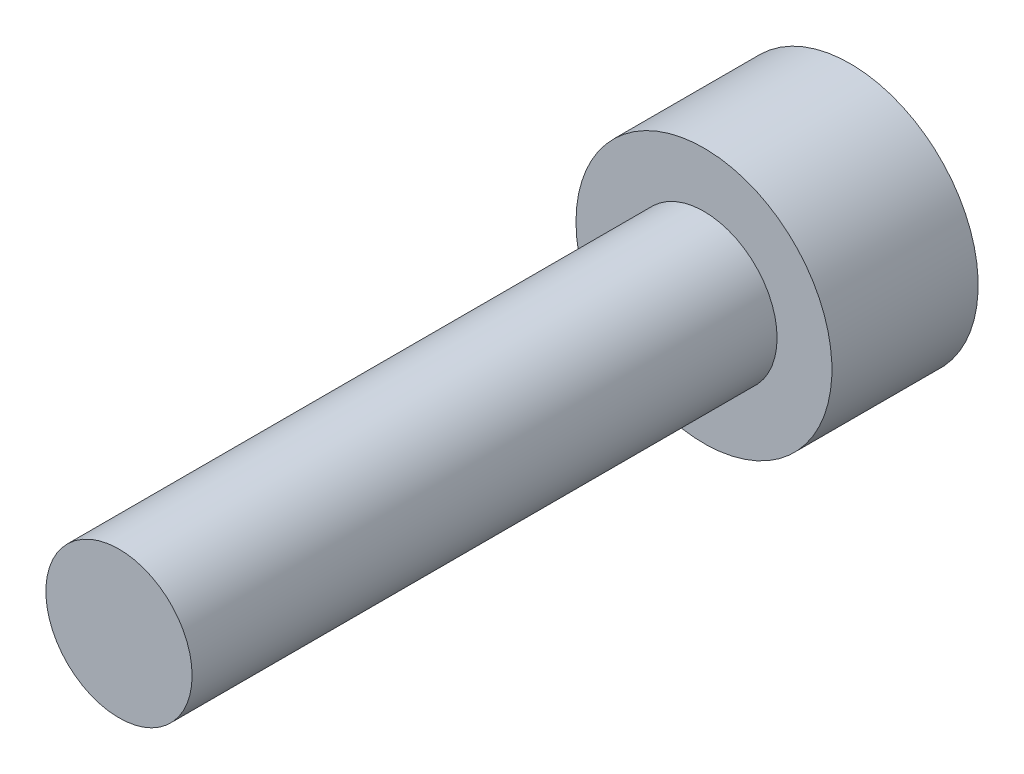
ISO-10303-21;
HEADER;
FILE_DESCRIPTION(('STEP AP214'),'2;1');
FILE_NAME('part.step','',(''),(''),'','','');
FILE_SCHEMA(('AUTOMOTIVE_DESIGN { 1 0 10303 214 1 1 1 1 }'));
ENDSEC;
DATA;
#1=APPLICATION_CONTEXT('core data for automotive mechanical design processes');
#2=APPLICATION_PROTOCOL_DEFINITION('international standard','automotive_design',2000,#1);
#3=PRODUCT_CONTEXT('',#1,'mechanical');
#4=PRODUCT('Part','Part','',(#3));
#5=PRODUCT_RELATED_PRODUCT_CATEGORY('part','',(#4));
#6=PRODUCT_DEFINITION_FORMATION('','',#4);
#7=PRODUCT_DEFINITION_CONTEXT('part definition',#1,'design');
#8=PRODUCT_DEFINITION('design','',#6,#7);
#9=PRODUCT_DEFINITION_SHAPE('','',#8);
#10=(LENGTH_UNIT() NAMED_UNIT(*) SI_UNIT(.MILLI.,.METRE.));
#11=(NAMED_UNIT(*) PLANE_ANGLE_UNIT() SI_UNIT($,.RADIAN.));
#12=(NAMED_UNIT(*) SI_UNIT($,.STERADIAN.) SOLID_ANGLE_UNIT());
#13=UNCERTAINTY_MEASURE_WITH_UNIT(LENGTH_MEASURE(1.E-05),#10,'distance_accuracy_value','');
#14=(GEOMETRIC_REPRESENTATION_CONTEXT(3) GLOBAL_UNCERTAINTY_ASSIGNED_CONTEXT((#13)) GLOBAL_UNIT_ASSIGNED_CONTEXT((#10,
#11,#12)) REPRESENTATION_CONTEXT('',''));
#15=CARTESIAN_POINT('',(0.,0.,0.));
#16=DIRECTION('',(0.,0.,1.));
#17=DIRECTION('',(1.,0.,0.));
#18=AXIS2_PLACEMENT_3D('',#15,#16,#17);
#19=CARTESIAN_POINT('',(3.5,0.,4.));
#20=DIRECTION('',(0.,0.,1.));
#21=DIRECTION('',(1.,0.,0.));
#22=AXIS2_PLACEMENT_3D('',#19,#20,#21);
#23=PLANE('',#22);
#24=CARTESIAN_POINT('',(0.,0.,4.));
#25=DIRECTION('',(0.,0.,-1.));
#26=DIRECTION('',(-1.,0.,0.));
#27=AXIS2_PLACEMENT_3D('',#24,#25,#26);
#28=CIRCLE('',#27,3.5);
#29=CARTESIAN_POINT('',(-3.5,0.,4.));
#30=VERTEX_POINT('',#29);
#31=EDGE_CURVE('E11',#30,#30,#28,.T.);
#32=ORIENTED_EDGE('',*,*,#31,.F.);
#33=EDGE_LOOP('',(#32));
#34=FACE_BOUND('',#33,.T.);
#35=CARTESIAN_POINT('',(0.,0.,4.));
#36=DIRECTION('',(0.,0.,1.));
#37=DIRECTION('',(1.,0.,0.));
#38=AXIS2_PLACEMENT_3D('',#35,#36,#37);
#39=CIRCLE('',#38,2.);
#40=CARTESIAN_POINT('',(2.,0.,4.));
#41=VERTEX_POINT('',#40);
#42=EDGE_CURVE('E132',#41,#41,#39,.T.);
#43=ORIENTED_EDGE('',*,*,#42,.F.);
#44=EDGE_LOOP('',(#43));
#45=FACE_BOUND('',#44,.T.);
#46=ADVANCED_FACE('F30',(#34,#45),#23,.T.);
#47=CARTESIAN_POINT('',(0.,0.,4.));
#48=DIRECTION('',(0.,0.,-1.));
#49=DIRECTION('',(-1.,0.,0.));
#50=AXIS2_PLACEMENT_3D('',#47,#48,#49);
#51=CYLINDRICAL_SURFACE('',#50,3.5);
#52=ORIENTED_EDGE('',*,*,#31,.T.);
#53=EDGE_LOOP('',(#52));
#54=FACE_BOUND('',#53,.T.);
#55=CARTESIAN_POINT('',(0.,0.,0.));
#56=DIRECTION('',(0.,0.,-1.));
#57=DIRECTION('',(-1.,0.,0.));
#58=AXIS2_PLACEMENT_3D('',#55,#56,#57);
#59=CIRCLE('',#58,3.5);
#60=CARTESIAN_POINT('',(-3.5,0.,0.));
#61=VERTEX_POINT('',#60);
#62=EDGE_CURVE('E38',#61,#61,#59,.T.);
#63=ORIENTED_EDGE('',*,*,#62,.F.);
#64=EDGE_LOOP('',(#63));
#65=FACE_BOUND('',#64,.T.);
#66=ADVANCED_FACE('F32',(#54,#65),#51,.T.);
#67=CARTESIAN_POINT('',(0.,0.,0.));
#68=DIRECTION('',(0.,0.,-1.));
#69=DIRECTION('',(-1.,0.,0.));
#70=AXIS2_PLACEMENT_3D('',#67,#68,#69);
#71=PLANE('',#70);
#72=DIRECTION('',(0.5,-0.866025403784439,0.));
#73=VECTOR('',#72,1.);
#74=CARTESIAN_POINT('',(0.850000000000006,1.47224318643355,0.));
#75=LINE('',#74,#73);
#76=CARTESIAN_POINT('',(0.850000000000006,1.47224318643355,0.));
#77=VERTEX_POINT('',#76);
#78=CARTESIAN_POINT('',(1.70000000000001,0.,0.));
#79=VERTEX_POINT('',#78);
#80=EDGE_CURVE('E45',#77,#79,#75,.T.);
#81=ORIENTED_EDGE('',*,*,#80,.F.);
#82=DIRECTION('',(1.,0.,0.));
#83=VECTOR('',#82,1.);
#84=CARTESIAN_POINT('',(-0.849999999999998,1.47224318643355,0.));
#85=LINE('',#84,#83);
#86=CARTESIAN_POINT('',(-0.849999999999998,1.47224318643355,0.));
#87=VERTEX_POINT('',#86);
#88=EDGE_CURVE('E128',#87,#77,#85,.T.);
#89=ORIENTED_EDGE('',*,*,#88,.F.);
#90=DIRECTION('',(0.500000000000001,0.866025403784438,0.));
#91=VECTOR('',#90,1.);
#92=CARTESIAN_POINT('',(-1.7,0.,0.));
#93=LINE('',#92,#91);
#94=CARTESIAN_POINT('',(-1.7,0.,0.));
#95=VERTEX_POINT('',#94);
#96=EDGE_CURVE('E126',#95,#87,#93,.T.);
#97=ORIENTED_EDGE('',*,*,#96,.F.);
#98=DIRECTION('',(-0.499999999999999,0.866025403784439,0.));
#99=VECTOR('',#98,1.);
#100=CARTESIAN_POINT('',(-0.849999999999999,-1.47224318643355,0.));
#101=LINE('',#100,#99);
#102=CARTESIAN_POINT('',(-0.849999999999999,-1.47224318643355,0.));
#103=VERTEX_POINT('',#102);
#104=EDGE_CURVE('E93',#103,#95,#101,.T.);
#105=ORIENTED_EDGE('',*,*,#104,.F.);
#106=DIRECTION('',(-1.,0.,0.));
#107=VECTOR('',#106,1.);
#108=CARTESIAN_POINT('',(0.850000000000003,-1.47224318643355,0.));
#109=LINE('',#108,#107);
#110=CARTESIAN_POINT('',(0.850000000000003,-1.47224318643355,0.));
#111=VERTEX_POINT('',#110);
#112=EDGE_CURVE('E122',#111,#103,#109,.T.);
#113=ORIENTED_EDGE('',*,*,#112,.F.);
#114=DIRECTION('',(-0.500000000000002,-0.866025403784438,0.));
#115=VECTOR('',#114,1.);
#116=CARTESIAN_POINT('',(1.70000000000001,0.,0.));
#117=LINE('',#116,#115);
#118=EDGE_CURVE('E119',#79,#111,#117,.T.);
#119=ORIENTED_EDGE('',*,*,#118,.F.);
#120=EDGE_LOOP('',(#81,#89,#97,#105,#113,#119));
#121=FACE_BOUND('',#120,.T.);
#122=ORIENTED_EDGE('',*,*,#62,.T.);
#123=EDGE_LOOP('',(#122));
#124=FACE_BOUND('',#123,.T.);
#125=ADVANCED_FACE('F145',(#121,#124),#71,.T.);
#126=CARTESIAN_POINT('',(0.,0.,20.));
#127=DIRECTION('',(0.,0.,-1.));
#128=DIRECTION('',(-1.,0.,0.));
#129=AXIS2_PLACEMENT_3D('',#126,#127,#128);
#130=CYLINDRICAL_SURFACE('',#129,2.);
#131=CARTESIAN_POINT('',(0.,0.,20.));
#132=DIRECTION('',(0.,0.,1.));
#133=DIRECTION('',(1.,0.,0.));
#134=AXIS2_PLACEMENT_3D('',#131,#132,#133);
#135=CIRCLE('',#134,2.);
#136=CARTESIAN_POINT('',(2.,0.,20.));
#137=VERTEX_POINT('',#136);
#138=EDGE_CURVE('E138',#137,#137,#135,.T.);
#139=ORIENTED_EDGE('',*,*,#138,.F.);
#140=EDGE_LOOP('',(#139));
#141=FACE_BOUND('',#140,.T.);
#142=ORIENTED_EDGE('',*,*,#42,.T.);
#143=EDGE_LOOP('',(#142));
#144=FACE_BOUND('',#143,.T.);
#145=ADVANCED_FACE('F153',(#141,#144),#130,.T.);
#146=CARTESIAN_POINT('',(0.,0.,20.));
#147=DIRECTION('',(0.,0.,1.));
#148=DIRECTION('',(1.,0.,0.));
#149=AXIS2_PLACEMENT_3D('',#146,#147,#148);
#150=PLANE('',#149);
#151=ORIENTED_EDGE('',*,*,#138,.T.);
#152=EDGE_LOOP('',(#151));
#153=FACE_BOUND('',#152,.T.);
#154=ADVANCED_FACE('F162',(#153),#150,.T.);
#155=CARTESIAN_POINT('',(0.850000000000006,1.47224318643355,2.4));
#156=DIRECTION('',(0.866025403784439,0.5,0.));
#157=DIRECTION('',(-0.5,0.866025403784439,0.));
#158=AXIS2_PLACEMENT_3D('',#155,#156,#157);
#159=PLANE('',#158);
#160=ORIENTED_EDGE('',*,*,#80,.T.);
#161=DIRECTION('',(0.,0.,-1.));
#162=VECTOR('',#161,1.);
#163=CARTESIAN_POINT('',(1.70000000000001,0.,2.4));
#164=LINE('',#163,#162);
#165=CARTESIAN_POINT('',(1.70000000000001,0.,2.4));
#166=VERTEX_POINT('',#165);
#167=EDGE_CURVE('E75',#166,#79,#164,.T.);
#168=ORIENTED_EDGE('',*,*,#167,.F.);
#169=DIRECTION('',(0.5,-0.866025403784439,0.));
#170=VECTOR('',#169,1.);
#171=CARTESIAN_POINT('',(0.850000000000006,1.47224318643355,2.4));
#172=LINE('',#171,#170);
#173=CARTESIAN_POINT('',(0.850000000000006,1.47224318643355,2.4));
#174=VERTEX_POINT('',#173);
#175=EDGE_CURVE('E130',#174,#166,#172,.T.);
#176=ORIENTED_EDGE('',*,*,#175,.F.);
#177=DIRECTION('',(0.,0.,-1.));
#178=VECTOR('',#177,1.);
#179=CARTESIAN_POINT('',(0.850000000000006,1.47224318643355,2.4));
#180=LINE('',#179,#178);
#181=EDGE_CURVE('E53',#174,#77,#180,.T.);
#182=ORIENTED_EDGE('',*,*,#181,.T.);
#183=EDGE_LOOP('',(#160,#168,#176,#182));
#184=FACE_BOUND('',#183,.T.);
#185=ADVANCED_FACE('F168',(#184),#159,.F.);
#186=CARTESIAN_POINT('',(-0.849999999999998,1.47224318643355,2.4));
#187=DIRECTION('',(0.,1.,0.));
#188=DIRECTION('',(-1.,0.,0.));
#189=AXIS2_PLACEMENT_3D('',#186,#187,#188);
#190=PLANE('',#189);
#191=ORIENTED_EDGE('',*,*,#88,.T.);
#192=ORIENTED_EDGE('',*,*,#181,.F.);
#193=DIRECTION('',(1.,0.,0.));
#194=VECTOR('',#193,1.);
#195=CARTESIAN_POINT('',(-0.849999999999998,1.47224318643355,2.4));
#196=LINE('',#195,#194);
#197=CARTESIAN_POINT('',(-0.849999999999998,1.47224318643355,2.4));
#198=VERTEX_POINT('',#197);
#199=EDGE_CURVE('E105',#198,#174,#196,.T.);
#200=ORIENTED_EDGE('',*,*,#199,.F.);
#201=DIRECTION('',(0.,0.,-1.));
#202=VECTOR('',#201,1.);
#203=CARTESIAN_POINT('',(-0.849999999999998,1.47224318643355,2.4));
#204=LINE('',#203,#202);
#205=EDGE_CURVE('E97',#198,#87,#204,.T.);
#206=ORIENTED_EDGE('',*,*,#205,.T.);
#207=EDGE_LOOP('',(#191,#192,#200,#206));
#208=FACE_BOUND('',#207,.T.);
#209=ADVANCED_FACE('F175',(#208),#190,.F.);
#210=CARTESIAN_POINT('',(-1.7,0.,2.4));
#211=DIRECTION('',(-0.866025403784438,0.500000000000001,0.));
#212=DIRECTION('',(-0.500000000000001,-0.866025403784438,0.));
#213=AXIS2_PLACEMENT_3D('',#210,#211,#212);
#214=PLANE('',#213);
#215=ORIENTED_EDGE('',*,*,#96,.T.);
#216=ORIENTED_EDGE('',*,*,#205,.F.);
#217=DIRECTION('',(0.500000000000001,0.866025403784438,0.));
#218=VECTOR('',#217,1.);
#219=CARTESIAN_POINT('',(-1.7,0.,2.4));
#220=LINE('',#219,#218);
#221=CARTESIAN_POINT('',(-1.7,0.,2.4));
#222=VERTEX_POINT('',#221);
#223=EDGE_CURVE('E101',#222,#198,#220,.T.);
#224=ORIENTED_EDGE('',*,*,#223,.F.);
#225=DIRECTION('',(0.,0.,-1.));
#226=VECTOR('',#225,1.);
#227=CARTESIAN_POINT('',(-1.7,0.,2.4));
#228=LINE('',#227,#226);
#229=EDGE_CURVE('E86',#222,#95,#228,.T.);
#230=ORIENTED_EDGE('',*,*,#229,.T.);
#231=EDGE_LOOP('',(#215,#216,#224,#230));
#232=FACE_BOUND('',#231,.T.);
#233=ADVANCED_FACE('F102',(#232),#214,.F.);
#234=CARTESIAN_POINT('',(-0.849999999999999,-1.47224318643355,2.4));
#235=DIRECTION('',(-0.866025403784439,-0.499999999999999,0.));
#236=DIRECTION('',(0.499999999999999,-0.866025403784439,0.));
#237=AXIS2_PLACEMENT_3D('',#234,#235,#236);
#238=PLANE('',#237);
#239=ORIENTED_EDGE('',*,*,#104,.T.);
#240=ORIENTED_EDGE('',*,*,#229,.F.);
#241=DIRECTION('',(-0.499999999999999,0.866025403784439,0.));
#242=VECTOR('',#241,1.);
#243=CARTESIAN_POINT('',(-0.849999999999999,-1.47224318643355,2.4));
#244=LINE('',#243,#242);
#245=CARTESIAN_POINT('',(-0.849999999999999,-1.47224318643355,2.4));
#246=VERTEX_POINT('',#245);
#247=EDGE_CURVE('E90',#246,#222,#244,.T.);
#248=ORIENTED_EDGE('',*,*,#247,.F.);
#249=DIRECTION('',(0.,0.,-1.));
#250=VECTOR('',#249,1.);
#251=CARTESIAN_POINT('',(-0.849999999999999,-1.47224318643355,2.4));
#252=LINE('',#251,#250);
#253=EDGE_CURVE('E98',#246,#103,#252,.T.);
#254=ORIENTED_EDGE('',*,*,#253,.T.);
#255=EDGE_LOOP('',(#239,#240,#248,#254));
#256=FACE_BOUND('',#255,.T.);
#257=ADVANCED_FACE('F88',(#256),#238,.F.);
#258=CARTESIAN_POINT('',(0.850000000000003,-1.47224318643355,2.4));
#259=DIRECTION('',(0.,-1.,0.));
#260=DIRECTION('',(1.,0.,0.));
#261=AXIS2_PLACEMENT_3D('',#258,#259,#260);
#262=PLANE('',#261);
#263=ORIENTED_EDGE('',*,*,#112,.T.);
#264=ORIENTED_EDGE('',*,*,#253,.F.);
#265=DIRECTION('',(-1.,0.,0.));
#266=VECTOR('',#265,1.);
#267=CARTESIAN_POINT('',(0.850000000000003,-1.47224318643355,2.4));
#268=LINE('',#267,#266);
#269=CARTESIAN_POINT('',(0.850000000000003,-1.47224318643355,2.4));
#270=VERTEX_POINT('',#269);
#271=EDGE_CURVE('E111',#270,#246,#268,.T.);
#272=ORIENTED_EDGE('',*,*,#271,.F.);
#273=DIRECTION('',(0.,0.,-1.));
#274=VECTOR('',#273,1.);
#275=CARTESIAN_POINT('',(0.850000000000003,-1.47224318643355,2.4));
#276=LINE('',#275,#274);
#277=EDGE_CURVE('E135',#270,#111,#276,.T.);
#278=ORIENTED_EDGE('',*,*,#277,.T.);
#279=EDGE_LOOP('',(#263,#264,#272,#278));
#280=FACE_BOUND('',#279,.T.);
#281=ADVANCED_FACE('F179',(#280),#262,.F.);
#282=CARTESIAN_POINT('',(1.70000000000001,0.,2.4));
#283=DIRECTION('',(0.866025403784438,-0.500000000000002,0.));
#284=DIRECTION('',(0.500000000000002,0.866025403784438,0.));
#285=AXIS2_PLACEMENT_3D('',#282,#283,#284);
#286=PLANE('',#285);
#287=ORIENTED_EDGE('',*,*,#118,.T.);
#288=ORIENTED_EDGE('',*,*,#277,.F.);
#289=DIRECTION('',(-0.500000000000002,-0.866025403784438,0.));
#290=VECTOR('',#289,1.);
#291=CARTESIAN_POINT('',(1.70000000000001,0.,2.4));
#292=LINE('',#291,#290);
#293=EDGE_CURVE('E113',#166,#270,#292,.T.);
#294=ORIENTED_EDGE('',*,*,#293,.F.);
#295=ORIENTED_EDGE('',*,*,#167,.T.);
#296=EDGE_LOOP('',(#287,#288,#294,#295));
#297=FACE_BOUND('',#296,.T.);
#298=ADVANCED_FACE('F176',(#297),#286,.F.);
#299=CARTESIAN_POINT('',(1.70000000000001,0.,2.4));
#300=DIRECTION('',(0.,0.,-1.));
#301=DIRECTION('',(-1.,0.,0.));
#302=AXIS2_PLACEMENT_3D('',#299,#300,#301);
#303=PLANE('',#302);
#304=ORIENTED_EDGE('',*,*,#175,.T.);
#305=ORIENTED_EDGE('',*,*,#293,.T.);
#306=ORIENTED_EDGE('',*,*,#271,.T.);
#307=ORIENTED_EDGE('',*,*,#247,.T.);
#308=ORIENTED_EDGE('',*,*,#223,.T.);
#309=ORIENTED_EDGE('',*,*,#199,.T.);
#310=EDGE_LOOP('',(#304,#305,#306,#307,#308,#309));
#311=FACE_BOUND('',#310,.T.);
#312=ADVANCED_FACE('F108',(#311),#303,.T.);
#313=CLOSED_SHELL('',(#46,#66,#125,#145,#154,#185,#209,#233,#257,#281,#298,#312));
#314=MANIFOLD_SOLID_BREP('B2',#313);
#315=ADVANCED_BREP_SHAPE_REPRESENTATION('',(#18,#314),#14);
#316=SHAPE_DEFINITION_REPRESENTATION(#9,#315);
ENDSEC;
END-ISO-10303-21;
